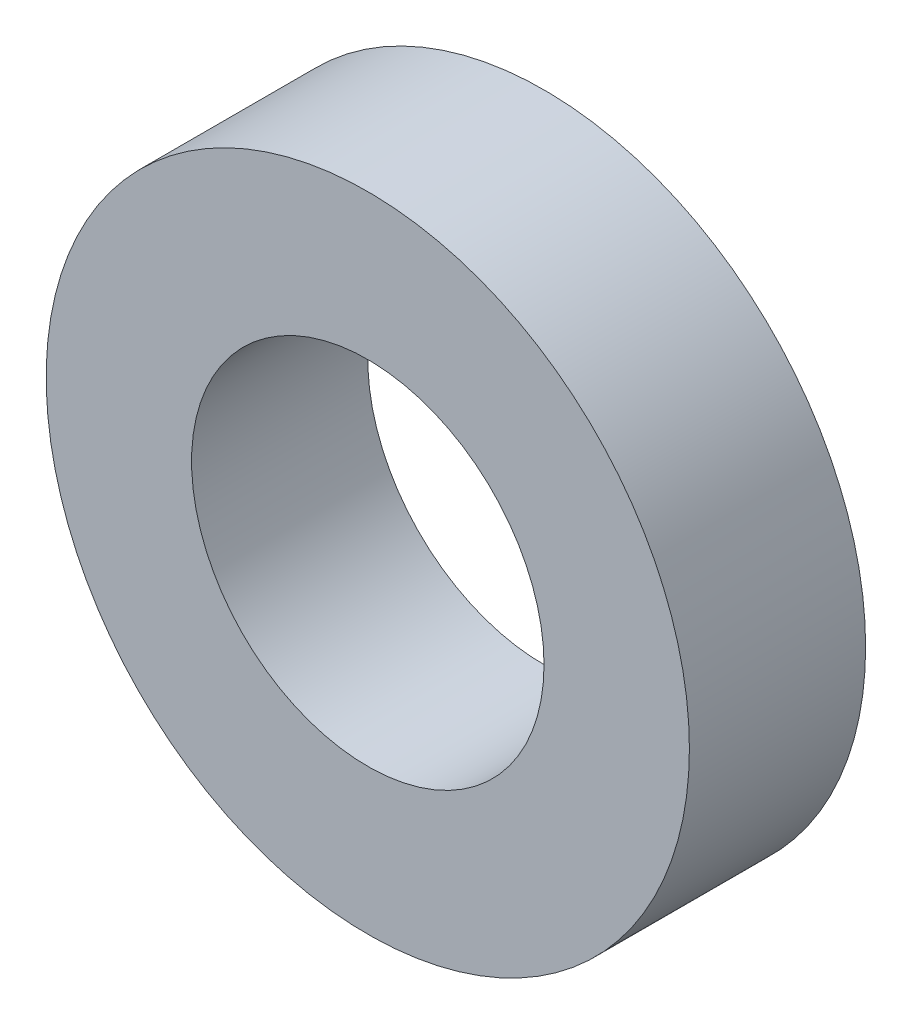
ISO-10303-21;
HEADER;
FILE_DESCRIPTION(('STEP AP214'),'2;1');
FILE_NAME('part.step','',(''),(''),'','','');
FILE_SCHEMA(('AUTOMOTIVE_DESIGN { 1 0 10303 214 1 1 1 1 }'));
ENDSEC;
DATA;
#1=APPLICATION_CONTEXT('core data for automotive mechanical design processes');
#2=APPLICATION_PROTOCOL_DEFINITION('international standard','automotive_design',2000,#1);
#3=PRODUCT_CONTEXT('',#1,'mechanical');
#4=PRODUCT('Part','Part','',(#3));
#5=PRODUCT_RELATED_PRODUCT_CATEGORY('part','',(#4));
#6=PRODUCT_DEFINITION_FORMATION('','',#4);
#7=PRODUCT_DEFINITION_CONTEXT('part definition',#1,'design');
#8=PRODUCT_DEFINITION('design','',#6,#7);
#9=PRODUCT_DEFINITION_SHAPE('','',#8);
#10=(LENGTH_UNIT() NAMED_UNIT(*) SI_UNIT(.MILLI.,.METRE.));
#11=(NAMED_UNIT(*) PLANE_ANGLE_UNIT() SI_UNIT($,.RADIAN.));
#12=(NAMED_UNIT(*) SI_UNIT($,.STERADIAN.) SOLID_ANGLE_UNIT());
#13=UNCERTAINTY_MEASURE_WITH_UNIT(LENGTH_MEASURE(1.E-05),#10,'distance_accuracy_value','');
#14=(GEOMETRIC_REPRESENTATION_CONTEXT(3) GLOBAL_UNCERTAINTY_ASSIGNED_CONTEXT((#13)) GLOBAL_UNIT_ASSIGNED_CONTEXT((#10,
#11,#12)) REPRESENTATION_CONTEXT('',''));
#15=CARTESIAN_POINT('',(0.,0.,0.));
#16=DIRECTION('',(0.,0.,1.));
#17=DIRECTION('',(1.,0.,0.));
#18=AXIS2_PLACEMENT_3D('',#15,#16,#17);
#19=CARTESIAN_POINT('',(192.420533360949,293.381259442632,2.));
#20=DIRECTION('',(0.,0.,1.));
#21=DIRECTION('',(1.,0.,0.));
#22=AXIS2_PLACEMENT_3D('',#19,#20,#21);
#23=PLANE('',#22);
#24=CARTESIAN_POINT('',(192.420533360949,293.381259442632,2.));
#25=DIRECTION('',(0.,0.,1.));
#26=DIRECTION('',(1.,0.,0.));
#27=AXIS2_PLACEMENT_3D('',#24,#25,#26);
#28=CIRCLE('',#27,3.64999999999999);
#29=CARTESIAN_POINT('',(196.070533360949,293.381259442632,2.));
#30=VERTEX_POINT('',#29);
#31=EDGE_CURVE('E10',#30,#30,#28,.T.);
#32=ORIENTED_EDGE('',*,*,#31,.T.);
#33=EDGE_LOOP('',(#32));
#34=FACE_BOUND('',#33,.T.);
#35=CARTESIAN_POINT('',(192.420533360949,293.381259442632,2.));
#36=DIRECTION('',(0.,0.,1.));
#37=DIRECTION('',(1.,0.,0.));
#38=AXIS2_PLACEMENT_3D('',#35,#36,#37);
#39=CIRCLE('',#38,2.);
#40=CARTESIAN_POINT('',(194.420533360949,293.381259442632,2.));
#41=VERTEX_POINT('',#40);
#42=EDGE_CURVE('E50',#41,#41,#39,.T.);
#43=ORIENTED_EDGE('',*,*,#42,.F.);
#44=EDGE_LOOP('',(#43));
#45=FACE_BOUND('',#44,.T.);
#46=ADVANCED_FACE('F37',(#34,#45),#23,.T.);
#47=CARTESIAN_POINT('',(192.420533360949,293.381259442632,0.));
#48=DIRECTION('',(0.,0.,1.));
#49=DIRECTION('',(1.,0.,0.));
#50=AXIS2_PLACEMENT_3D('',#47,#48,#49);
#51=PLANE('',#50);
#52=CARTESIAN_POINT('',(192.420533360949,293.381259442632,0.));
#53=DIRECTION('',(0.,0.,1.));
#54=DIRECTION('',(1.,0.,0.));
#55=AXIS2_PLACEMENT_3D('',#52,#53,#54);
#56=CIRCLE('',#55,3.64999999999999);
#57=CARTESIAN_POINT('',(196.070533360949,293.381259442632,0.));
#58=VERTEX_POINT('',#57);
#59=EDGE_CURVE('E41',#58,#58,#56,.T.);
#60=ORIENTED_EDGE('',*,*,#59,.F.);
#61=EDGE_LOOP('',(#60));
#62=FACE_BOUND('',#61,.T.);
#63=CARTESIAN_POINT('',(192.420533360949,293.381259442632,0.));
#64=DIRECTION('',(0.,0.,1.));
#65=DIRECTION('',(1.,0.,0.));
#66=AXIS2_PLACEMENT_3D('',#63,#64,#65);
#67=CIRCLE('',#66,2.);
#68=CARTESIAN_POINT('',(194.420533360949,293.381259442632,0.));
#69=VERTEX_POINT('',#68);
#70=EDGE_CURVE('E52',#69,#69,#67,.T.);
#71=ORIENTED_EDGE('',*,*,#70,.T.);
#72=EDGE_LOOP('',(#71));
#73=FACE_BOUND('',#72,.T.);
#74=ADVANCED_FACE('F64',(#62,#73),#51,.F.);
#75=CARTESIAN_POINT('',(192.420533360949,293.381259442632,2.));
#76=DIRECTION('',(0.,0.,-1.));
#77=DIRECTION('',(-1.,0.,0.));
#78=AXIS2_PLACEMENT_3D('',#75,#76,#77);
#79=CYLINDRICAL_SURFACE('',#78,3.64999999999999);
#80=ORIENTED_EDGE('',*,*,#31,.F.);
#81=EDGE_LOOP('',(#80));
#82=FACE_BOUND('',#81,.T.);
#83=ORIENTED_EDGE('',*,*,#59,.T.);
#84=EDGE_LOOP('',(#83));
#85=FACE_BOUND('',#84,.T.);
#86=ADVANCED_FACE('F39',(#82,#85),#79,.T.);
#87=CARTESIAN_POINT('',(192.420533360949,293.381259442632,2.));
#88=DIRECTION('',(0.,0.,-1.));
#89=DIRECTION('',(-1.,0.,0.));
#90=AXIS2_PLACEMENT_3D('',#87,#88,#89);
#91=CYLINDRICAL_SURFACE('',#90,2.);
#92=ORIENTED_EDGE('',*,*,#42,.T.);
#93=EDGE_LOOP('',(#92));
#94=FACE_BOUND('',#93,.T.);
#95=ORIENTED_EDGE('',*,*,#70,.F.);
#96=EDGE_LOOP('',(#95));
#97=FACE_BOUND('',#96,.T.);
#98=ADVANCED_FACE('F60',(#94,#97),#91,.F.);
#99=CLOSED_SHELL('',(#46,#74,#86,#98));
#100=MANIFOLD_SOLID_BREP('B2',#99);
#101=ADVANCED_BREP_SHAPE_REPRESENTATION('',(#18,#100),#14);
#102=SHAPE_DEFINITION_REPRESENTATION(#9,#101);
ENDSEC;
END-ISO-10303-21;
